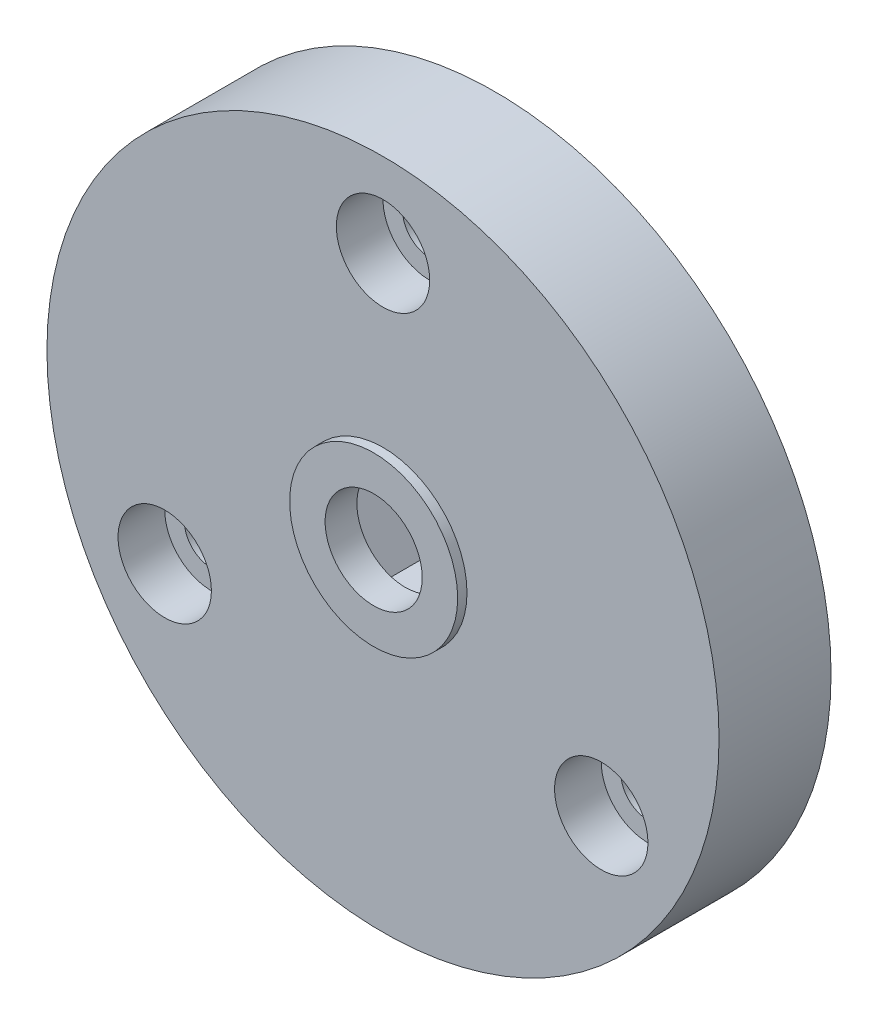
ISO-10303-21;
HEADER;
FILE_DESCRIPTION(('STEP AP214'),'2;1');
FILE_NAME('part.step','',(''),(''),'','','');
FILE_SCHEMA(('AUTOMOTIVE_DESIGN { 1 0 10303 214 1 1 1 1 }'));
ENDSEC;
DATA;
#1=APPLICATION_CONTEXT('core data for automotive mechanical design processes');
#2=APPLICATION_PROTOCOL_DEFINITION('international standard','automotive_design',2000,#1);
#3=PRODUCT_CONTEXT('',#1,'mechanical');
#4=PRODUCT('Part','Part','',(#3));
#5=PRODUCT_RELATED_PRODUCT_CATEGORY('part','',(#4));
#6=PRODUCT_DEFINITION_FORMATION('','',#4);
#7=PRODUCT_DEFINITION_CONTEXT('part definition',#1,'design');
#8=PRODUCT_DEFINITION('design','',#6,#7);
#9=PRODUCT_DEFINITION_SHAPE('','',#8);
#10=(LENGTH_UNIT() NAMED_UNIT(*) SI_UNIT(.MILLI.,.METRE.));
#11=(NAMED_UNIT(*) PLANE_ANGLE_UNIT() SI_UNIT($,.RADIAN.));
#12=(NAMED_UNIT(*) SI_UNIT($,.STERADIAN.) SOLID_ANGLE_UNIT());
#13=UNCERTAINTY_MEASURE_WITH_UNIT(LENGTH_MEASURE(1.E-05),#10,'distance_accuracy_value','');
#14=(GEOMETRIC_REPRESENTATION_CONTEXT(3) GLOBAL_UNCERTAINTY_ASSIGNED_CONTEXT((#13)) GLOBAL_UNIT_ASSIGNED_CONTEXT((#10,
#11,#12)) REPRESENTATION_CONTEXT('',''));
#15=CARTESIAN_POINT('',(0.,0.,0.));
#16=DIRECTION('',(0.,0.,1.));
#17=DIRECTION('',(1.,0.,0.));
#18=AXIS2_PLACEMENT_3D('',#15,#16,#17);
#19=CARTESIAN_POINT('',(300.,300.,328.));
#20=DIRECTION('',(0.,0.,1.));
#21=DIRECTION('',(1.,0.,0.));
#22=AXIS2_PLACEMENT_3D('',#19,#20,#21);
#23=PLANE('',#22);
#24=CARTESIAN_POINT('',(300.,300.,328.));
#25=DIRECTION('',(0.,0.,1.));
#26=DIRECTION('',(1.,0.,0.));
#27=AXIS2_PLACEMENT_3D('',#24,#25,#26);
#28=CIRCLE('',#27,18.);
#29=CARTESIAN_POINT('',(318.,300.,328.));
#30=VERTEX_POINT('',#29);
#31=EDGE_CURVE('E11',#30,#30,#28,.T.);
#32=ORIENTED_EDGE('',*,*,#31,.T.);
#33=EDGE_LOOP('',(#32));
#34=FACE_BOUND('',#33,.T.);
#35=CARTESIAN_POINT('',(311.69134295109,293.25,328.));
#36=DIRECTION('',(0.,0.,1.));
#37=DIRECTION('',(1.,0.,0.));
#38=AXIS2_PLACEMENT_3D('',#35,#36,#37);
#39=CIRCLE('',#38,2.5);
#40=CARTESIAN_POINT('',(314.19134295109,293.25,328.));
#41=VERTEX_POINT('',#40);
#42=EDGE_CURVE('E151',#41,#41,#39,.T.);
#43=ORIENTED_EDGE('',*,*,#42,.F.);
#44=EDGE_LOOP('',(#43));
#45=FACE_BOUND('',#44,.T.);
#46=CARTESIAN_POINT('',(288.30865704891,293.25,328.));
#47=DIRECTION('',(0.,0.,1.));
#48=DIRECTION('',(1.,0.,0.));
#49=AXIS2_PLACEMENT_3D('',#46,#47,#48);
#50=CIRCLE('',#49,2.5);
#51=CARTESIAN_POINT('',(290.80865704891,293.25,328.));
#52=VERTEX_POINT('',#51);
#53=EDGE_CURVE('E165',#52,#52,#50,.T.);
#54=ORIENTED_EDGE('',*,*,#53,.F.);
#55=EDGE_LOOP('',(#54));
#56=FACE_BOUND('',#55,.T.);
#57=CARTESIAN_POINT('',(300.,313.5,328.));
#58=DIRECTION('',(0.,0.,1.));
#59=DIRECTION('',(1.,0.,0.));
#60=AXIS2_PLACEMENT_3D('',#57,#58,#59);
#61=CIRCLE('',#60,2.5);
#62=CARTESIAN_POINT('',(302.5,313.5,328.));
#63=VERTEX_POINT('',#62);
#64=EDGE_CURVE('E155',#63,#63,#61,.T.);
#65=ORIENTED_EDGE('',*,*,#64,.F.);
#66=EDGE_LOOP('',(#65));
#67=FACE_BOUND('',#66,.T.);
#68=CARTESIAN_POINT('',(300.,300.,328.));
#69=DIRECTION('',(0.,0.,1.));
#70=DIRECTION('',(1.,0.,0.));
#71=AXIS2_PLACEMENT_3D('',#68,#69,#70);
#72=CIRCLE('',#71,4.5);
#73=CARTESIAN_POINT('',(304.5,300.,328.));
#74=VERTEX_POINT('',#73);
#75=EDGE_CURVE('E362',#74,#74,#72,.T.);
#76=ORIENTED_EDGE('',*,*,#75,.F.);
#77=EDGE_LOOP('',(#76));
#78=FACE_BOUND('',#77,.T.);
#79=ADVANCED_FACE('F39',(#34,#45,#56,#67,#78),#23,.T.);
#80=CARTESIAN_POINT('',(300.,300.,323.2));
#81=DIRECTION('',(0.,0.,1.));
#82=DIRECTION('',(1.,0.,0.));
#83=AXIS2_PLACEMENT_3D('',#80,#81,#82);
#84=PLANE('',#83);
#85=CARTESIAN_POINT('',(300.,300.,323.2));
#86=DIRECTION('',(0.,0.,1.));
#87=DIRECTION('',(1.,0.,0.));
#88=AXIS2_PLACEMENT_3D('',#85,#86,#87);
#89=CIRCLE('',#88,7.6);
#90=CARTESIAN_POINT('',(307.6,300.,323.2));
#91=VERTEX_POINT('',#90);
#92=EDGE_CURVE('E148',#91,#91,#89,.T.);
#93=ORIENTED_EDGE('',*,*,#92,.F.);
#94=EDGE_LOOP('',(#93));
#95=FACE_BOUND('',#94,.T.);
#96=DIRECTION('',(0.499999999999998,0.86602540378444,0.));
#97=VECTOR('',#96,1.);
#98=CARTESIAN_POINT('',(302.367136103677,295.9,323.2));
#99=LINE('',#98,#97);
#100=CARTESIAN_POINT('',(302.367136103677,295.9,323.2));
#101=VERTEX_POINT('',#100);
#102=CARTESIAN_POINT('',(304.734272207355,300.,323.2));
#103=VERTEX_POINT('',#102);
#104=EDGE_CURVE('E56',#101,#103,#99,.T.);
#105=ORIENTED_EDGE('',*,*,#104,.T.);
#106=DIRECTION('',(-0.499999999999993,0.866025403784443,0.));
#107=VECTOR('',#106,1.);
#108=CARTESIAN_POINT('',(304.734272207355,300.,323.2));
#109=LINE('',#108,#107);
#110=CARTESIAN_POINT('',(302.367136103677,304.1,323.2));
#111=VERTEX_POINT('',#110);
#112=EDGE_CURVE('E127',#103,#111,#109,.T.);
#113=ORIENTED_EDGE('',*,*,#112,.T.);
#114=DIRECTION('',(-1.,0.,0.));
#115=VECTOR('',#114,1.);
#116=CARTESIAN_POINT('',(302.367136103677,304.1,323.2));
#117=LINE('',#116,#115);
#118=CARTESIAN_POINT('',(297.632863896323,304.1,323.2));
#119=VERTEX_POINT('',#118);
#120=EDGE_CURVE('E131',#111,#119,#117,.T.);
#121=ORIENTED_EDGE('',*,*,#120,.T.);
#122=DIRECTION('',(-0.499999999999993,-0.866025403784443,0.));
#123=VECTOR('',#122,1.);
#124=CARTESIAN_POINT('',(297.632863896323,304.1,323.2));
#125=LINE('',#124,#123);
#126=CARTESIAN_POINT('',(295.265727792645,300.,323.2));
#127=VERTEX_POINT('',#126);
#128=EDGE_CURVE('E134',#119,#127,#125,.T.);
#129=ORIENTED_EDGE('',*,*,#128,.T.);
#130=DIRECTION('',(0.499999999999998,-0.86602540378444,0.));
#131=VECTOR('',#130,1.);
#132=CARTESIAN_POINT('',(295.265727792645,300.,323.2));
#133=LINE('',#132,#131);
#134=CARTESIAN_POINT('',(297.632863896323,295.9,323.2));
#135=VERTEX_POINT('',#134);
#136=EDGE_CURVE('E117',#127,#135,#133,.T.);
#137=ORIENTED_EDGE('',*,*,#136,.T.);
#138=DIRECTION('',(1.,0.,0.));
#139=VECTOR('',#138,1.);
#140=CARTESIAN_POINT('',(297.632863896323,295.9,323.2));
#141=LINE('',#140,#139);
#142=EDGE_CURVE('E137',#135,#101,#141,.T.);
#143=ORIENTED_EDGE('',*,*,#142,.T.);
#144=EDGE_LOOP('',(#105,#113,#121,#129,#137,#143));
#145=FACE_BOUND('',#144,.T.);
#146=ADVANCED_FACE('F214',(#95,#145),#84,.F.);
#147=CARTESIAN_POINT('',(300.,313.5,328.));
#148=DIRECTION('',(0.,0.,-1.));
#149=DIRECTION('',(-1.,0.,0.));
#150=AXIS2_PLACEMENT_3D('',#147,#148,#149);
#151=CYLINDRICAL_SURFACE('',#150,1.45000000000001);
#152=CARTESIAN_POINT('',(300.,313.5,322.));
#153=DIRECTION('',(0.,0.,1.));
#154=DIRECTION('',(1.,0.,0.));
#155=AXIS2_PLACEMENT_3D('',#152,#153,#154);
#156=CIRCLE('',#155,1.45000000000001);
#157=CARTESIAN_POINT('',(301.45,313.5,322.));
#158=VERTEX_POINT('',#157);
#159=EDGE_CURVE('E180',#158,#158,#156,.T.);
#160=ORIENTED_EDGE('',*,*,#159,.F.);
#161=EDGE_LOOP('',(#160));
#162=FACE_BOUND('',#161,.T.);
#163=CARTESIAN_POINT('',(300.,313.5,325.5));
#164=DIRECTION('',(0.,0.,1.));
#165=DIRECTION('',(1.,0.,0.));
#166=AXIS2_PLACEMENT_3D('',#163,#164,#165);
#167=CIRCLE('',#166,1.45000000000001);
#168=CARTESIAN_POINT('',(301.45,313.5,325.5));
#169=VERTEX_POINT('',#168);
#170=EDGE_CURVE('E177',#169,#169,#167,.T.);
#171=ORIENTED_EDGE('',*,*,#170,.T.);
#172=EDGE_LOOP('',(#171));
#173=FACE_BOUND('',#172,.T.);
#174=ADVANCED_FACE('F192',(#162,#173),#151,.F.);
#175=CARTESIAN_POINT('',(288.30865704891,293.25,328.));
#176=DIRECTION('',(0.,0.,-1.));
#177=DIRECTION('',(-1.,0.,0.));
#178=AXIS2_PLACEMENT_3D('',#175,#176,#177);
#179=CYLINDRICAL_SURFACE('',#178,1.45000000000001);
#180=CARTESIAN_POINT('',(288.30865704891,293.25,322.));
#181=DIRECTION('',(0.,0.,1.));
#182=DIRECTION('',(1.,0.,0.));
#183=AXIS2_PLACEMENT_3D('',#180,#181,#182);
#184=CIRCLE('',#183,1.45000000000001);
#185=CARTESIAN_POINT('',(289.75865704891,293.25,322.));
#186=VERTEX_POINT('',#185);
#187=EDGE_CURVE('E176',#186,#186,#184,.T.);
#188=ORIENTED_EDGE('',*,*,#187,.F.);
#189=EDGE_LOOP('',(#188));
#190=FACE_BOUND('',#189,.T.);
#191=CARTESIAN_POINT('',(288.30865704891,293.25,325.5));
#192=DIRECTION('',(0.,0.,1.));
#193=DIRECTION('',(1.,0.,0.));
#194=AXIS2_PLACEMENT_3D('',#191,#192,#193);
#195=CIRCLE('',#194,1.45000000000001);
#196=CARTESIAN_POINT('',(289.75865704891,293.25,325.5));
#197=VERTEX_POINT('',#196);
#198=EDGE_CURVE('E187',#197,#197,#195,.T.);
#199=ORIENTED_EDGE('',*,*,#198,.T.);
#200=EDGE_LOOP('',(#199));
#201=FACE_BOUND('',#200,.T.);
#202=ADVANCED_FACE('F238',(#190,#201),#179,.F.);
#203=CARTESIAN_POINT('',(311.69134295109,293.25,328.));
#204=DIRECTION('',(0.,0.,-1.));
#205=DIRECTION('',(-1.,0.,0.));
#206=AXIS2_PLACEMENT_3D('',#203,#204,#205);
#207=CYLINDRICAL_SURFACE('',#206,1.45000000000001);
#208=CARTESIAN_POINT('',(311.69134295109,293.25,322.));
#209=DIRECTION('',(0.,0.,1.));
#210=DIRECTION('',(1.,0.,0.));
#211=AXIS2_PLACEMENT_3D('',#208,#209,#210);
#212=CIRCLE('',#211,1.45000000000001);
#213=CARTESIAN_POINT('',(313.14134295109,293.25,322.));
#214=VERTEX_POINT('',#213);
#215=EDGE_CURVE('E173',#214,#214,#212,.T.);
#216=ORIENTED_EDGE('',*,*,#215,.F.);
#217=EDGE_LOOP('',(#216));
#218=FACE_BOUND('',#217,.T.);
#219=CARTESIAN_POINT('',(311.69134295109,293.25,325.5));
#220=DIRECTION('',(0.,0.,1.));
#221=DIRECTION('',(1.,0.,0.));
#222=AXIS2_PLACEMENT_3D('',#219,#220,#221);
#223=CIRCLE('',#222,1.45000000000001);
#224=CARTESIAN_POINT('',(313.14134295109,293.25,325.5));
#225=VERTEX_POINT('',#224);
#226=EDGE_CURVE('E158',#225,#225,#223,.T.);
#227=ORIENTED_EDGE('',*,*,#226,.T.);
#228=EDGE_LOOP('',(#227));
#229=FACE_BOUND('',#228,.T.);
#230=ADVANCED_FACE('F230',(#218,#229),#207,.F.);
#231=CARTESIAN_POINT('',(300.,300.,322.));
#232=DIRECTION('',(0.,0.,1.));
#233=DIRECTION('',(1.,0.,0.));
#234=AXIS2_PLACEMENT_3D('',#231,#232,#233);
#235=PLANE('',#234);
#236=CARTESIAN_POINT('',(300.,300.,322.));
#237=DIRECTION('',(0.,0.,1.));
#238=DIRECTION('',(1.,0.,0.));
#239=AXIS2_PLACEMENT_3D('',#236,#237,#238);
#240=CIRCLE('',#239,7.6);
#241=CARTESIAN_POINT('',(307.6,300.,322.));
#242=VERTEX_POINT('',#241);
#243=EDGE_CURVE('E152',#242,#242,#240,.T.);
#244=ORIENTED_EDGE('',*,*,#243,.T.);
#245=EDGE_LOOP('',(#244));
#246=FACE_BOUND('',#245,.T.);
#247=CARTESIAN_POINT('',(300.,300.,322.));
#248=DIRECTION('',(0.,0.,1.));
#249=DIRECTION('',(1.,0.,0.));
#250=AXIS2_PLACEMENT_3D('',#247,#248,#249);
#251=CIRCLE('',#250,18.);
#252=CARTESIAN_POINT('',(318.,300.,322.));
#253=VERTEX_POINT('',#252);
#254=EDGE_CURVE('E48',#253,#253,#251,.T.);
#255=ORIENTED_EDGE('',*,*,#254,.F.);
#256=EDGE_LOOP('',(#255));
#257=FACE_BOUND('',#256,.T.);
#258=ORIENTED_EDGE('',*,*,#159,.T.);
#259=EDGE_LOOP('',(#258));
#260=FACE_BOUND('',#259,.T.);
#261=ORIENTED_EDGE('',*,*,#187,.T.);
#262=EDGE_LOOP('',(#261));
#263=FACE_BOUND('',#262,.T.);
#264=ORIENTED_EDGE('',*,*,#215,.T.);
#265=EDGE_LOOP('',(#264));
#266=FACE_BOUND('',#265,.T.);
#267=ADVANCED_FACE('F228',(#246,#257,#260,#263,#266),#235,.F.);
#268=CARTESIAN_POINT('',(300.,300.,328.));
#269=DIRECTION('',(0.,0.,-1.));
#270=DIRECTION('',(-1.,0.,0.));
#271=AXIS2_PLACEMENT_3D('',#268,#269,#270);
#272=CYLINDRICAL_SURFACE('',#271,18.);
#273=ORIENTED_EDGE('',*,*,#31,.F.);
#274=EDGE_LOOP('',(#273));
#275=FACE_BOUND('',#274,.T.);
#276=ORIENTED_EDGE('',*,*,#254,.T.);
#277=EDGE_LOOP('',(#276));
#278=FACE_BOUND('',#277,.T.);
#279=ADVANCED_FACE('F41',(#275,#278),#272,.T.);
#280=CARTESIAN_POINT('',(300.,300.,328.));
#281=DIRECTION('',(0.,0.,-1.));
#282=DIRECTION('',(-1.,0.,0.));
#283=AXIS2_PLACEMENT_3D('',#280,#281,#282);
#284=CYLINDRICAL_SURFACE('',#283,2.59999999999999);
#285=CARTESIAN_POINT('',(300.,300.,326.8));
#286=DIRECTION('',(0.,0.,1.));
#287=DIRECTION('',(1.,0.,0.));
#288=AXIS2_PLACEMENT_3D('',#285,#286,#287);
#289=CIRCLE('',#288,2.59999999999999);
#290=CARTESIAN_POINT('',(302.6,300.,326.8));
#291=VERTEX_POINT('',#290);
#292=EDGE_CURVE('E43',#291,#291,#289,.T.);
#293=ORIENTED_EDGE('',*,*,#292,.F.);
#294=EDGE_LOOP('',(#293));
#295=FACE_BOUND('',#294,.T.);
#296=CARTESIAN_POINT('',(300.,300.,328.5));
#297=DIRECTION('',(0.,0.,1.));
#298=DIRECTION('',(1.,0.,0.));
#299=AXIS2_PLACEMENT_3D('',#296,#297,#298);
#300=CIRCLE('',#299,2.59999999999999);
#301=CARTESIAN_POINT('',(302.6,300.,328.5));
#302=VERTEX_POINT('',#301);
#303=EDGE_CURVE('E367',#302,#302,#300,.T.);
#304=ORIENTED_EDGE('',*,*,#303,.T.);
#305=EDGE_LOOP('',(#304));
#306=FACE_BOUND('',#305,.T.);
#307=ADVANCED_FACE('F226',(#295,#306),#284,.F.);
#308=CARTESIAN_POINT('',(311.69134295109,293.25,328.));
#309=DIRECTION('',(0.,0.,-1.));
#310=DIRECTION('',(-1.,0.,0.));
#311=AXIS2_PLACEMENT_3D('',#308,#309,#310);
#312=CYLINDRICAL_SURFACE('',#311,2.5);
#313=ORIENTED_EDGE('',*,*,#42,.T.);
#314=EDGE_LOOP('',(#313));
#315=FACE_BOUND('',#314,.T.);
#316=CARTESIAN_POINT('',(311.69134295109,293.25,325.5));
#317=DIRECTION('',(0.,0.,1.));
#318=DIRECTION('',(1.,0.,0.));
#319=AXIS2_PLACEMENT_3D('',#316,#317,#318);
#320=CIRCLE('',#319,2.5);
#321=CARTESIAN_POINT('',(314.19134295109,293.25,325.5));
#322=VERTEX_POINT('',#321);
#323=EDGE_CURVE('E168',#322,#322,#320,.T.);
#324=ORIENTED_EDGE('',*,*,#323,.F.);
#325=EDGE_LOOP('',(#324));
#326=FACE_BOUND('',#325,.T.);
#327=ADVANCED_FACE('F256',(#315,#326),#312,.F.);
#328=CARTESIAN_POINT('',(311.69134295109,293.25,325.5));
#329=DIRECTION('',(0.,0.,1.));
#330=DIRECTION('',(1.,0.,0.));
#331=AXIS2_PLACEMENT_3D('',#328,#329,#330);
#332=PLANE('',#331);
#333=ORIENTED_EDGE('',*,*,#226,.F.);
#334=EDGE_LOOP('',(#333));
#335=FACE_BOUND('',#334,.T.);
#336=ORIENTED_EDGE('',*,*,#323,.T.);
#337=EDGE_LOOP('',(#336));
#338=FACE_BOUND('',#337,.T.);
#339=ADVANCED_FACE('F253',(#335,#338),#332,.T.);
#340=CARTESIAN_POINT('',(288.30865704891,293.25,328.));
#341=DIRECTION('',(0.,0.,-1.));
#342=DIRECTION('',(-1.,0.,0.));
#343=AXIS2_PLACEMENT_3D('',#340,#341,#342);
#344=CYLINDRICAL_SURFACE('',#343,2.5);
#345=ORIENTED_EDGE('',*,*,#53,.T.);
#346=EDGE_LOOP('',(#345));
#347=FACE_BOUND('',#346,.T.);
#348=CARTESIAN_POINT('',(288.30865704891,293.25,325.5));
#349=DIRECTION('',(0.,0.,1.));
#350=DIRECTION('',(1.,0.,0.));
#351=AXIS2_PLACEMENT_3D('',#348,#349,#350);
#352=CIRCLE('',#351,2.5);
#353=CARTESIAN_POINT('',(290.80865704891,293.25,325.5));
#354=VERTEX_POINT('',#353);
#355=EDGE_CURVE('E162',#354,#354,#352,.T.);
#356=ORIENTED_EDGE('',*,*,#355,.F.);
#357=EDGE_LOOP('',(#356));
#358=FACE_BOUND('',#357,.T.);
#359=ADVANCED_FACE('F209',(#347,#358),#344,.F.);
#360=CARTESIAN_POINT('',(288.30865704891,293.25,325.5));
#361=DIRECTION('',(0.,0.,1.));
#362=DIRECTION('',(1.,0.,0.));
#363=AXIS2_PLACEMENT_3D('',#360,#361,#362);
#364=PLANE('',#363);
#365=ORIENTED_EDGE('',*,*,#198,.F.);
#366=EDGE_LOOP('',(#365));
#367=FACE_BOUND('',#366,.T.);
#368=ORIENTED_EDGE('',*,*,#355,.T.);
#369=EDGE_LOOP('',(#368));
#370=FACE_BOUND('',#369,.T.);
#371=ADVANCED_FACE('F203',(#367,#370),#364,.T.);
#372=CARTESIAN_POINT('',(300.,313.5,328.));
#373=DIRECTION('',(0.,0.,-1.));
#374=DIRECTION('',(-1.,0.,0.));
#375=AXIS2_PLACEMENT_3D('',#372,#373,#374);
#376=CYLINDRICAL_SURFACE('',#375,2.5);
#377=ORIENTED_EDGE('',*,*,#64,.T.);
#378=EDGE_LOOP('',(#377));
#379=FACE_BOUND('',#378,.T.);
#380=CARTESIAN_POINT('',(300.,313.5,325.5));
#381=DIRECTION('',(0.,0.,1.));
#382=DIRECTION('',(1.,0.,0.));
#383=AXIS2_PLACEMENT_3D('',#380,#381,#382);
#384=CIRCLE('',#383,2.5);
#385=CARTESIAN_POINT('',(302.5,313.5,325.5));
#386=VERTEX_POINT('',#385);
#387=EDGE_CURVE('E159',#386,#386,#384,.T.);
#388=ORIENTED_EDGE('',*,*,#387,.F.);
#389=EDGE_LOOP('',(#388));
#390=FACE_BOUND('',#389,.T.);
#391=ADVANCED_FACE('F198',(#379,#390),#376,.F.);
#392=CARTESIAN_POINT('',(300.,313.5,325.5));
#393=DIRECTION('',(0.,0.,1.));
#394=DIRECTION('',(1.,0.,0.));
#395=AXIS2_PLACEMENT_3D('',#392,#393,#394);
#396=PLANE('',#395);
#397=ORIENTED_EDGE('',*,*,#170,.F.);
#398=EDGE_LOOP('',(#397));
#399=FACE_BOUND('',#398,.T.);
#400=ORIENTED_EDGE('',*,*,#387,.T.);
#401=EDGE_LOOP('',(#400));
#402=FACE_BOUND('',#401,.T.);
#403=ADVANCED_FACE('F194',(#399,#402),#396,.T.);
#404=CARTESIAN_POINT('',(300.,300.,323.2));
#405=DIRECTION('',(0.,0.,-1.));
#406=DIRECTION('',(-1.,0.,0.));
#407=AXIS2_PLACEMENT_3D('',#404,#405,#406);
#408=CYLINDRICAL_SURFACE('',#407,7.6);
#409=ORIENTED_EDGE('',*,*,#92,.T.);
#410=EDGE_LOOP('',(#409));
#411=FACE_BOUND('',#410,.T.);
#412=ORIENTED_EDGE('',*,*,#243,.F.);
#413=EDGE_LOOP('',(#412));
#414=FACE_BOUND('',#413,.T.);
#415=ADVANCED_FACE('F197',(#411,#414),#408,.F.);
#416=CARTESIAN_POINT('',(302.367136103677,295.9,326.8));
#417=DIRECTION('',(-0.86602540378444,0.499999999999998,0.));
#418=DIRECTION('',(-0.499999999999998,-0.86602540378444,0.));
#419=AXIS2_PLACEMENT_3D('',#416,#417,#418);
#420=PLANE('',#419);
#421=ORIENTED_EDGE('',*,*,#104,.F.);
#422=DIRECTION('',(0.,0.,-1.));
#423=VECTOR('',#422,1.);
#424=CARTESIAN_POINT('',(302.367136103677,295.9,326.8));
#425=LINE('',#424,#423);
#426=CARTESIAN_POINT('',(302.367136103677,295.9,326.8));
#427=VERTEX_POINT('',#426);
#428=EDGE_CURVE('E122',#427,#101,#425,.T.);
#429=ORIENTED_EDGE('',*,*,#428,.F.);
#430=DIRECTION('',(0.499999999999998,0.86602540378444,0.));
#431=VECTOR('',#430,1.);
#432=CARTESIAN_POINT('',(302.367136103677,295.9,326.8));
#433=LINE('',#432,#431);
#434=CARTESIAN_POINT('',(304.734272207355,300.,326.8));
#435=VERTEX_POINT('',#434);
#436=EDGE_CURVE('E140',#427,#435,#433,.T.);
#437=ORIENTED_EDGE('',*,*,#436,.T.);
#438=DIRECTION('',(0.,0.,-1.));
#439=VECTOR('',#438,1.);
#440=CARTESIAN_POINT('',(304.734272207355,300.,326.8));
#441=LINE('',#440,#439);
#442=EDGE_CURVE('E146',#435,#103,#441,.T.);
#443=ORIENTED_EDGE('',*,*,#442,.T.);
#444=EDGE_LOOP('',(#421,#429,#437,#443));
#445=FACE_BOUND('',#444,.T.);
#446=ADVANCED_FACE('F348',(#445),#420,.T.);
#447=CARTESIAN_POINT('',(304.734272207355,300.,326.8));
#448=DIRECTION('',(-0.866025403784443,-0.499999999999993,0.));
#449=DIRECTION('',(0.499999999999993,-0.866025403784443,0.));
#450=AXIS2_PLACEMENT_3D('',#447,#448,#449);
#451=PLANE('',#450);
#452=ORIENTED_EDGE('',*,*,#112,.F.);
#453=ORIENTED_EDGE('',*,*,#442,.F.);
#454=DIRECTION('',(-0.499999999999993,0.866025403784443,0.));
#455=VECTOR('',#454,1.);
#456=CARTESIAN_POINT('',(304.734272207355,300.,326.8));
#457=LINE('',#456,#455);
#458=CARTESIAN_POINT('',(302.367136103677,304.1,326.8));
#459=VERTEX_POINT('',#458);
#460=EDGE_CURVE('E95',#435,#459,#457,.T.);
#461=ORIENTED_EDGE('',*,*,#460,.T.);
#462=DIRECTION('',(0.,0.,-1.));
#463=VECTOR('',#462,1.);
#464=CARTESIAN_POINT('',(302.367136103677,304.1,326.8));
#465=LINE('',#464,#463);
#466=EDGE_CURVE('E144',#459,#111,#465,.T.);
#467=ORIENTED_EDGE('',*,*,#466,.T.);
#468=EDGE_LOOP('',(#452,#453,#461,#467));
#469=FACE_BOUND('',#468,.T.);
#470=ADVANCED_FACE('F344',(#469),#451,.T.);
#471=CARTESIAN_POINT('',(302.367136103677,304.1,326.8));
#472=DIRECTION('',(0.,-1.,0.));
#473=DIRECTION('',(0.,0.,-1.));
#474=AXIS2_PLACEMENT_3D('',#471,#472,#473);
#475=PLANE('',#474);
#476=ORIENTED_EDGE('',*,*,#120,.F.);
#477=ORIENTED_EDGE('',*,*,#466,.F.);
#478=DIRECTION('',(-1.,0.,0.));
#479=VECTOR('',#478,1.);
#480=CARTESIAN_POINT('',(302.367136103677,304.1,326.8));
#481=LINE('',#480,#479);
#482=CARTESIAN_POINT('',(297.632863896323,304.1,326.8));
#483=VERTEX_POINT('',#482);
#484=EDGE_CURVE('E113',#459,#483,#481,.T.);
#485=ORIENTED_EDGE('',*,*,#484,.T.);
#486=DIRECTION('',(0.,0.,-1.));
#487=VECTOR('',#486,1.);
#488=CARTESIAN_POINT('',(297.632863896323,304.1,326.8));
#489=LINE('',#488,#487);
#490=EDGE_CURVE('E110',#483,#119,#489,.T.);
#491=ORIENTED_EDGE('',*,*,#490,.T.);
#492=EDGE_LOOP('',(#476,#477,#485,#491));
#493=FACE_BOUND('',#492,.T.);
#494=ADVANCED_FACE('F341',(#493),#475,.T.);
#495=CARTESIAN_POINT('',(297.632863896323,304.1,326.8));
#496=DIRECTION('',(0.866025403784443,-0.499999999999993,0.));
#497=DIRECTION('',(0.499999999999993,0.866025403784443,0.));
#498=AXIS2_PLACEMENT_3D('',#495,#496,#497);
#499=PLANE('',#498);
#500=ORIENTED_EDGE('',*,*,#128,.F.);
#501=ORIENTED_EDGE('',*,*,#490,.F.);
#502=DIRECTION('',(-0.499999999999993,-0.866025403784443,0.));
#503=VECTOR('',#502,1.);
#504=CARTESIAN_POINT('',(297.632863896323,304.1,326.8));
#505=LINE('',#504,#503);
#506=CARTESIAN_POINT('',(295.265727792645,300.,326.8));
#507=VERTEX_POINT('',#506);
#508=EDGE_CURVE('E105',#483,#507,#505,.T.);
#509=ORIENTED_EDGE('',*,*,#508,.T.);
#510=DIRECTION('',(0.,0.,-1.));
#511=VECTOR('',#510,1.);
#512=CARTESIAN_POINT('',(295.265727792645,300.,326.8));
#513=LINE('',#512,#511);
#514=EDGE_CURVE('E109',#507,#127,#513,.T.);
#515=ORIENTED_EDGE('',*,*,#514,.T.);
#516=EDGE_LOOP('',(#500,#501,#509,#515));
#517=FACE_BOUND('',#516,.T.);
#518=ADVANCED_FACE('F108',(#517),#499,.T.);
#519=CARTESIAN_POINT('',(295.265727792645,300.,326.8));
#520=DIRECTION('',(0.86602540378444,0.499999999999998,0.));
#521=DIRECTION('',(-0.499999999999998,0.86602540378444,0.));
#522=AXIS2_PLACEMENT_3D('',#519,#520,#521);
#523=PLANE('',#522);
#524=ORIENTED_EDGE('',*,*,#136,.F.);
#525=ORIENTED_EDGE('',*,*,#514,.F.);
#526=DIRECTION('',(0.499999999999998,-0.86602540378444,0.));
#527=VECTOR('',#526,1.);
#528=CARTESIAN_POINT('',(295.265727792645,300.,326.8));
#529=LINE('',#528,#527);
#530=CARTESIAN_POINT('',(297.632863896323,295.9,326.8));
#531=VERTEX_POINT('',#530);
#532=EDGE_CURVE('E112',#507,#531,#529,.T.);
#533=ORIENTED_EDGE('',*,*,#532,.T.);
#534=DIRECTION('',(0.,0.,-1.));
#535=VECTOR('',#534,1.);
#536=CARTESIAN_POINT('',(297.632863896323,295.9,326.8));
#537=LINE('',#536,#535);
#538=EDGE_CURVE('E86',#531,#135,#537,.T.);
#539=ORIENTED_EDGE('',*,*,#538,.T.);
#540=EDGE_LOOP('',(#524,#525,#533,#539));
#541=FACE_BOUND('',#540,.T.);
#542=ADVANCED_FACE('F115',(#541),#523,.T.);
#543=CARTESIAN_POINT('',(297.632863896323,295.9,326.8));
#544=DIRECTION('',(0.,1.,0.));
#545=DIRECTION('',(0.,0.,1.));
#546=AXIS2_PLACEMENT_3D('',#543,#544,#545);
#547=PLANE('',#546);
#548=ORIENTED_EDGE('',*,*,#142,.F.);
#549=ORIENTED_EDGE('',*,*,#538,.F.);
#550=DIRECTION('',(1.,0.,0.));
#551=VECTOR('',#550,1.);
#552=CARTESIAN_POINT('',(297.632863896323,295.9,326.8));
#553=LINE('',#552,#551);
#554=EDGE_CURVE('E64',#531,#427,#553,.T.);
#555=ORIENTED_EDGE('',*,*,#554,.T.);
#556=ORIENTED_EDGE('',*,*,#428,.T.);
#557=EDGE_LOOP('',(#548,#549,#555,#556));
#558=FACE_BOUND('',#557,.T.);
#559=ADVANCED_FACE('F333',(#558),#547,.T.);
#560=CARTESIAN_POINT('',(0.,0.,326.8));
#561=DIRECTION('',(0.,0.,1.));
#562=DIRECTION('',(1.,0.,0.));
#563=AXIS2_PLACEMENT_3D('',#560,#561,#562);
#564=PLANE('',#563);
#565=ORIENTED_EDGE('',*,*,#292,.T.);
#566=EDGE_LOOP('',(#565));
#567=FACE_BOUND('',#566,.T.);
#568=ORIENTED_EDGE('',*,*,#436,.F.);
#569=ORIENTED_EDGE('',*,*,#554,.F.);
#570=ORIENTED_EDGE('',*,*,#532,.F.);
#571=ORIENTED_EDGE('',*,*,#508,.F.);
#572=ORIENTED_EDGE('',*,*,#484,.F.);
#573=ORIENTED_EDGE('',*,*,#460,.F.);
#574=EDGE_LOOP('',(#568,#569,#570,#571,#572,#573));
#575=FACE_BOUND('',#574,.T.);
#576=ADVANCED_FACE('F120',(#567,#575),#564,.F.);
#577=CARTESIAN_POINT('',(300.,300.,328.5));
#578=DIRECTION('',(0.,0.,1.));
#579=DIRECTION('',(1.,0.,0.));
#580=AXIS2_PLACEMENT_3D('',#577,#578,#579);
#581=PLANE('',#580);
#582=CARTESIAN_POINT('',(300.,300.,328.5));
#583=DIRECTION('',(0.,0.,1.));
#584=DIRECTION('',(1.,0.,0.));
#585=AXIS2_PLACEMENT_3D('',#582,#583,#584);
#586=CIRCLE('',#585,4.5);
#587=CARTESIAN_POINT('',(304.5,300.,328.5));
#588=VERTEX_POINT('',#587);
#589=EDGE_CURVE('E128',#588,#588,#586,.T.);
#590=ORIENTED_EDGE('',*,*,#589,.T.);
#591=EDGE_LOOP('',(#590));
#592=FACE_BOUND('',#591,.T.);
#593=ORIENTED_EDGE('',*,*,#303,.F.);
#594=EDGE_LOOP('',(#593));
#595=FACE_BOUND('',#594,.T.);
#596=ADVANCED_FACE('F311',(#592,#595),#581,.T.);
#597=CARTESIAN_POINT('',(300.,300.,328.5));
#598=DIRECTION('',(0.,0.,-1.));
#599=DIRECTION('',(-1.,0.,0.));
#600=AXIS2_PLACEMENT_3D('',#597,#598,#599);
#601=CYLINDRICAL_SURFACE('',#600,4.5);
#602=ORIENTED_EDGE('',*,*,#589,.F.);
#603=EDGE_LOOP('',(#602));
#604=FACE_BOUND('',#603,.T.);
#605=ORIENTED_EDGE('',*,*,#75,.T.);
#606=EDGE_LOOP('',(#605));
#607=FACE_BOUND('',#606,.T.);
#608=ADVANCED_FACE('F316',(#604,#607),#601,.T.);
#609=CLOSED_SHELL('',(#79,#146,#174,#202,#230,#267,#279,#307,#327,#339,#359,#371,#391,#403,#415,
#446,#470,#494,#518,#542,#559,#576,#596,#608));
#610=MANIFOLD_SOLID_BREP('B2',#609);
#611=ADVANCED_BREP_SHAPE_REPRESENTATION('',(#18,#610),#14);
#612=SHAPE_DEFINITION_REPRESENTATION(#9,#611);
ENDSEC;
END-ISO-10303-21;
